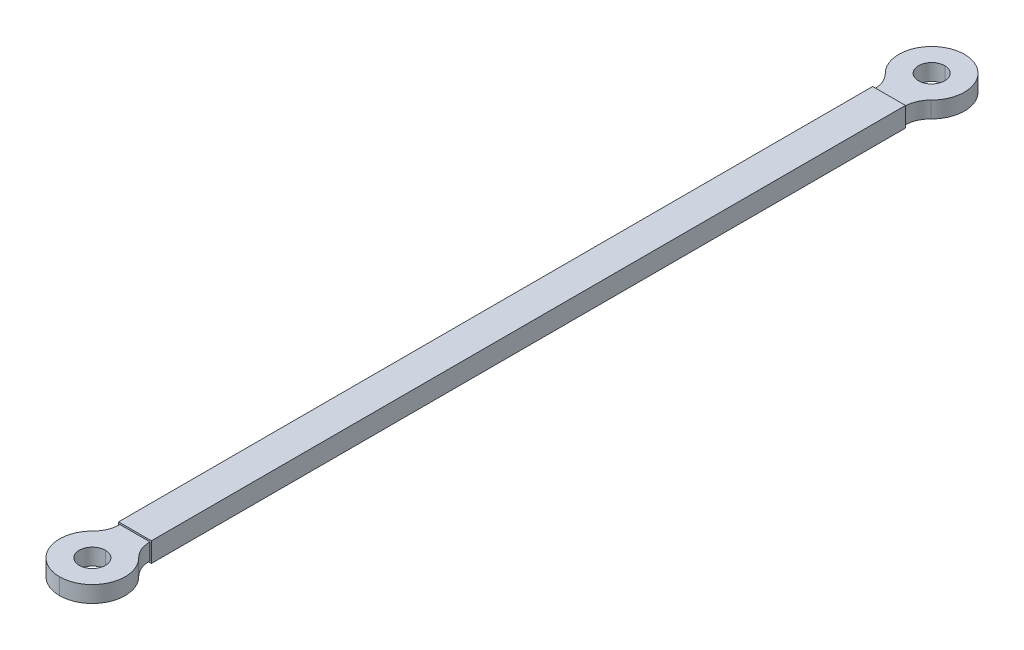
ISO-10303-21;
HEADER;
FILE_DESCRIPTION(('STEP AP214'),'2;1');
FILE_NAME('part.step','',(''),(''),'','','');
FILE_SCHEMA(('AUTOMOTIVE_DESIGN { 1 0 10303 214 1 1 1 1 }'));
ENDSEC;
DATA;
#1=APPLICATION_CONTEXT('core data for automotive mechanical design processes');
#2=APPLICATION_PROTOCOL_DEFINITION('international standard','automotive_design',2000,#1);
#3=PRODUCT_CONTEXT('',#1,'mechanical');
#4=PRODUCT('Part','Part','',(#3));
#5=PRODUCT_RELATED_PRODUCT_CATEGORY('part','',(#4));
#6=PRODUCT_DEFINITION_FORMATION('','',#4);
#7=PRODUCT_DEFINITION_CONTEXT('part definition',#1,'design');
#8=PRODUCT_DEFINITION('design','',#6,#7);
#9=PRODUCT_DEFINITION_SHAPE('','',#8);
#10=(LENGTH_UNIT() NAMED_UNIT(*) SI_UNIT(.MILLI.,.METRE.));
#11=(NAMED_UNIT(*) PLANE_ANGLE_UNIT() SI_UNIT($,.RADIAN.));
#12=(NAMED_UNIT(*) SI_UNIT($,.STERADIAN.) SOLID_ANGLE_UNIT());
#13=UNCERTAINTY_MEASURE_WITH_UNIT(LENGTH_MEASURE(1.E-05),#10,'distance_accuracy_value','');
#14=(GEOMETRIC_REPRESENTATION_CONTEXT(3) GLOBAL_UNCERTAINTY_ASSIGNED_CONTEXT((#13)) GLOBAL_UNIT_ASSIGNED_CONTEXT((#10,
#11,#12)) REPRESENTATION_CONTEXT('',''));
#15=CARTESIAN_POINT('',(0.,0.,0.));
#16=DIRECTION('',(0.,0.,1.));
#17=DIRECTION('',(1.,0.,0.));
#18=AXIS2_PLACEMENT_3D('',#15,#16,#17);
#19=CARTESIAN_POINT('',(-117.23273455505,-360.000000000027,968.57296703716));
#20=DIRECTION('',(0.,-1.,0.));
#21=DIRECTION('',(0.,0.,-1.));
#22=AXIS2_PLACEMENT_3D('',#19,#20,#21);
#23=CYLINDRICAL_SURFACE('',#22,20.);
#24=DIRECTION('',(0.,-1.,0.));
#25=VECTOR('',#24,1.);
#26=CARTESIAN_POINT('',(-117.23273455505,-360.000000000027,988.57296703716));
#27=LINE('',#26,#25);
#28=CARTESIAN_POINT('',(-117.23273455505,-362.500000000031,988.57296703716));
#29=VERTEX_POINT('',#28);
#30=CARTESIAN_POINT('',(-117.23273455505,-387.500000000031,988.57296703716));
#31=VERTEX_POINT('',#30);
#32=EDGE_CURVE('E630',#29,#31,#27,.T.);
#33=ORIENTED_EDGE('',*,*,#32,.F.);
#34=CARTESIAN_POINT('',(-117.23273455505,-362.500000000031,968.57296703716));
#35=DIRECTION('',(0.,-1.,0.));
#36=DIRECTION('',(0.,0.,-1.));
#37=AXIS2_PLACEMENT_3D('',#34,#35,#36);
#38=CIRCLE('',#37,20.);
#39=CARTESIAN_POINT('',(-117.23273455505,-362.500000000031,948.57296703716));
#40=VERTEX_POINT('',#39);
#41=EDGE_CURVE('E376',#40,#29,#38,.T.);
#42=ORIENTED_EDGE('',*,*,#41,.F.);
#43=DIRECTION('',(0.,-1.,0.));
#44=VECTOR('',#43,1.);
#45=CARTESIAN_POINT('',(-117.23273455505,-360.000000000027,948.57296703716));
#46=LINE('',#45,#44);
#47=CARTESIAN_POINT('',(-117.23273455505,-387.500000000031,948.572967037159));
#48=VERTEX_POINT('',#47);
#49=EDGE_CURVE('E612',#40,#48,#46,.T.);
#50=ORIENTED_EDGE('',*,*,#49,.T.);
#51=CARTESIAN_POINT('',(-117.23273455505,-387.500000000031,968.572967037159));
#52=DIRECTION('',(0.,-1.,0.));
#53=DIRECTION('',(0.,0.,-1.));
#54=AXIS2_PLACEMENT_3D('',#51,#52,#53);
#55=CIRCLE('',#54,20.);
#56=EDGE_CURVE('E353',#48,#31,#55,.T.);
#57=ORIENTED_EDGE('',*,*,#56,.T.);
#58=EDGE_LOOP('',(#33,#42,#50,#57));
#59=FACE_BOUND('',#58,.T.);
#60=ADVANCED_FACE('F17',(#59),#23,.F.);
#61=CARTESIAN_POINT('',(-117.23273455505,-387.500000000031,968.572967037159));
#62=DIRECTION('',(0.,1.,0.));
#63=DIRECTION('',(0.,0.,1.));
#64=AXIS2_PLACEMENT_3D('',#61,#62,#63);
#65=CYLINDRICAL_SURFACE('',#64,50.);
#66=CARTESIAN_POINT('',(-117.23273455505,-387.500000000031,968.572967037159));
#67=DIRECTION('',(0.,1.,0.));
#68=DIRECTION('',(0.,0.,1.));
#69=AXIS2_PLACEMENT_3D('',#66,#67,#68);
#70=CIRCLE('',#69,50.);
#71=CARTESIAN_POINT('',(-82.2332550633311,-387.500000000031,1004.2806193726));
#72=VERTEX_POINT('',#71);
#73=CARTESIAN_POINT('',(-152.232214046769,-387.500000000031,1004.2806193726));
#74=VERTEX_POINT('',#73);
#75=EDGE_CURVE('E283',#72,#74,#70,.T.);
#76=ORIENTED_EDGE('',*,*,#75,.T.);
#77=DIRECTION('',(0.,1.,0.));
#78=VECTOR('',#77,1.);
#79=CARTESIAN_POINT('',(-152.232214046769,-387.500000000031,1004.2806193726));
#80=LINE('',#79,#78);
#81=CARTESIAN_POINT('',(-152.232214046769,-362.500000000031,1004.2806193726));
#82=VERTEX_POINT('',#81);
#83=EDGE_CURVE('E11',#74,#82,#80,.T.);
#84=ORIENTED_EDGE('',*,*,#83,.T.);
#85=CARTESIAN_POINT('',(-117.23273455505,-362.500000000031,968.57296703716));
#86=DIRECTION('',(0.,1.,0.));
#87=DIRECTION('',(0.,0.,1.));
#88=AXIS2_PLACEMENT_3D('',#85,#86,#87);
#89=CIRCLE('',#88,50.);
#90=CARTESIAN_POINT('',(-82.2332550633312,-362.500000000031,1004.2806193726));
#91=VERTEX_POINT('',#90);
#92=EDGE_CURVE('E369',#91,#82,#89,.T.);
#93=ORIENTED_EDGE('',*,*,#92,.F.);
#94=DIRECTION('',(0.,-1.,0.));
#95=VECTOR('',#94,1.);
#96=CARTESIAN_POINT('',(-82.2332550633311,-387.500000000031,1004.2806193726));
#97=LINE('',#96,#95);
#98=EDGE_CURVE('E26',#91,#72,#97,.T.);
#99=ORIENTED_EDGE('',*,*,#98,.T.);
#100=EDGE_LOOP('',(#76,#84,#93,#99));
#101=FACE_BOUND('',#100,.T.);
#102=ADVANCED_FACE('F772',(#101),#65,.T.);
#103=CARTESIAN_POINT('',(-180.231797640144,-387.500000000032,1032.84674124095));
#104=DIRECTION('',(0.,1.,0.));
#105=DIRECTION('',(0.,0.,1.));
#106=AXIS2_PLACEMENT_3D('',#103,#104,#105);
#107=CYLINDRICAL_SURFACE('',#106,40.);
#108=CARTESIAN_POINT('',(-180.231797640144,-387.500000000032,1032.84674124095));
#109=DIRECTION('',(0.,-1.,0.));
#110=DIRECTION('',(0.,0.,1.));
#111=AXIS2_PLACEMENT_3D('',#108,#109,#110);
#112=CIRCLE('',#111,40.);
#113=CARTESIAN_POINT('',(-140.23273455505,-387.500000000032,1032.57296703716));
#114=VERTEX_POINT('',#113);
#115=EDGE_CURVE('E287',#74,#114,#112,.T.);
#116=ORIENTED_EDGE('',*,*,#115,.T.);
#117=DIRECTION('',(0.,1.,0.));
#118=VECTOR('',#117,1.);
#119=CARTESIAN_POINT('',(-140.23273455505,-387.500000000032,1032.57296703716));
#120=LINE('',#119,#118);
#121=CARTESIAN_POINT('',(-140.23273455505,-362.500000000032,1032.57296703716));
#122=VERTEX_POINT('',#121);
#123=EDGE_CURVE('E67',#114,#122,#120,.T.);
#124=ORIENTED_EDGE('',*,*,#123,.T.);
#125=CARTESIAN_POINT('',(-180.231797640144,-362.500000000032,1032.84674124095));
#126=DIRECTION('',(0.,-1.,0.));
#127=DIRECTION('',(0.,0.,1.));
#128=AXIS2_PLACEMENT_3D('',#125,#126,#127);
#129=CIRCLE('',#128,40.);
#130=EDGE_CURVE('E373',#82,#122,#129,.T.);
#131=ORIENTED_EDGE('',*,*,#130,.F.);
#132=ORIENTED_EDGE('',*,*,#83,.F.);
#133=EDGE_LOOP('',(#116,#124,#131,#132));
#134=FACE_BOUND('',#133,.T.);
#135=ADVANCED_FACE('F779',(#134),#107,.F.);
#136=CARTESIAN_POINT('',(-54.2336714699559,-387.500000000032,1032.84674124095));
#137=DIRECTION('',(0.,1.,0.));
#138=DIRECTION('',(0.,0.,1.));
#139=AXIS2_PLACEMENT_3D('',#136,#137,#138);
#140=CYLINDRICAL_SURFACE('',#139,40.);
#141=CARTESIAN_POINT('',(-54.2336714699559,-387.500000000032,1032.84674124095));
#142=DIRECTION('',(0.,-1.,0.));
#143=DIRECTION('',(0.,0.,1.));
#144=AXIS2_PLACEMENT_3D('',#141,#142,#143);
#145=CIRCLE('',#144,40.);
#146=CARTESIAN_POINT('',(-94.23273455505,-387.500000000032,1032.57296703716));
#147=VERTEX_POINT('',#146);
#148=EDGE_CURVE('E286',#147,#72,#145,.T.);
#149=ORIENTED_EDGE('',*,*,#148,.T.);
#150=ORIENTED_EDGE('',*,*,#98,.F.);
#151=CARTESIAN_POINT('',(-54.2336714699559,-362.500000000032,1032.84674124095));
#152=DIRECTION('',(0.,-1.,0.));
#153=DIRECTION('',(0.,0.,1.));
#154=AXIS2_PLACEMENT_3D('',#151,#152,#153);
#155=CIRCLE('',#154,40.);
#156=CARTESIAN_POINT('',(-94.23273455505,-362.500000000032,1032.57296703716));
#157=VERTEX_POINT('',#156);
#158=EDGE_CURVE('E346',#157,#91,#155,.T.);
#159=ORIENTED_EDGE('',*,*,#158,.F.);
#160=DIRECTION('',(0.,-1.,0.));
#161=VECTOR('',#160,1.);
#162=CARTESIAN_POINT('',(-94.23273455505,-387.500000000032,1032.57296703716));
#163=LINE('',#162,#161);
#164=EDGE_CURVE('E350',#157,#147,#163,.T.);
#165=ORIENTED_EDGE('',*,*,#164,.T.);
#166=EDGE_LOOP('',(#149,#150,#159,#165));
#167=FACE_BOUND('',#166,.T.);
#168=ADVANCED_FACE('F790',(#167),#140,.F.);
#169=CARTESIAN_POINT('',(-117.23273455505,-360.000000000031,2248.57296703716));
#170=DIRECTION('',(0.,-1.,0.));
#171=DIRECTION('',(0.,0.,-1.));
#172=AXIS2_PLACEMENT_3D('',#169,#170,#171);
#173=CYLINDRICAL_SURFACE('',#172,20.);
#174=DIRECTION('',(0.,-1.,0.));
#175=VECTOR('',#174,1.);
#176=CARTESIAN_POINT('',(-117.23273455505,-360.000000000031,2268.57296703716));
#177=LINE('',#176,#175);
#178=CARTESIAN_POINT('',(-117.23273455505,-362.500000000036,2268.57296703716));
#179=VERTEX_POINT('',#178);
#180=CARTESIAN_POINT('',(-117.23273455505,-387.500000000036,2268.57296703716));
#181=VERTEX_POINT('',#180);
#182=EDGE_CURVE('E660',#179,#181,#177,.T.);
#183=ORIENTED_EDGE('',*,*,#182,.F.);
#184=CARTESIAN_POINT('',(-117.23273455505,-362.500000000036,2248.57296703716));
#185=DIRECTION('',(0.,-1.,0.));
#186=DIRECTION('',(0.,0.,-1.));
#187=AXIS2_PLACEMENT_3D('',#184,#185,#186);
#188=CIRCLE('',#187,20.);
#189=CARTESIAN_POINT('',(-117.23273455505,-362.500000000036,2228.57296703716));
#190=VERTEX_POINT('',#189);
#191=EDGE_CURVE('E280',#190,#179,#188,.T.);
#192=ORIENTED_EDGE('',*,*,#191,.F.);
#193=DIRECTION('',(0.,-1.,0.));
#194=VECTOR('',#193,1.);
#195=CARTESIAN_POINT('',(-117.23273455505,-360.000000000031,2228.57296703716));
#196=LINE('',#195,#194);
#197=CARTESIAN_POINT('',(-117.23273455505,-387.500000000036,2228.57296703716));
#198=VERTEX_POINT('',#197);
#199=EDGE_CURVE('E646',#190,#198,#196,.T.);
#200=ORIENTED_EDGE('',*,*,#199,.T.);
#201=CARTESIAN_POINT('',(-117.23273455505,-387.500000000036,2248.57296703716));
#202=DIRECTION('',(0.,-1.,0.));
#203=DIRECTION('',(0.,0.,-1.));
#204=AXIS2_PLACEMENT_3D('',#201,#202,#203);
#205=CIRCLE('',#204,20.);
#206=EDGE_CURVE('E323',#198,#181,#205,.T.);
#207=ORIENTED_EDGE('',*,*,#206,.T.);
#208=EDGE_LOOP('',(#183,#192,#200,#207));
#209=FACE_BOUND('',#208,.T.);
#210=ADVANCED_FACE('F973',(#209),#173,.F.);
#211=CARTESIAN_POINT('',(-180.231797640144,-387.500000000036,2184.29919283336));
#212=DIRECTION('',(0.,1.,0.));
#213=DIRECTION('',(0.,0.,1.));
#214=AXIS2_PLACEMENT_3D('',#211,#212,#213);
#215=CYLINDRICAL_SURFACE('',#214,40.);
#216=CARTESIAN_POINT('',(-180.231797640144,-387.500000000036,2184.29919283336));
#217=DIRECTION('',(0.,-1.,0.));
#218=DIRECTION('',(0.,0.,1.));
#219=AXIS2_PLACEMENT_3D('',#216,#217,#218);
#220=CIRCLE('',#219,40.);
#221=CARTESIAN_POINT('',(-140.23273455505,-387.500000000036,2184.57296703716));
#222=VERTEX_POINT('',#221);
#223=CARTESIAN_POINT('',(-152.232214046769,-387.500000000036,2212.86531470172));
#224=VERTEX_POINT('',#223);
#225=EDGE_CURVE('E313',#222,#224,#220,.T.);
#226=ORIENTED_EDGE('',*,*,#225,.T.);
#227=DIRECTION('',(0.,-1.,0.));
#228=VECTOR('',#227,1.);
#229=CARTESIAN_POINT('',(-152.232214046769,-387.500000000036,2212.86531470172));
#230=LINE('',#229,#228);
#231=CARTESIAN_POINT('',(-152.232214046769,-362.500000000036,2212.86531470172));
#232=VERTEX_POINT('',#231);
#233=EDGE_CURVE('E675',#232,#224,#230,.T.);
#234=ORIENTED_EDGE('',*,*,#233,.F.);
#235=CARTESIAN_POINT('',(-180.231797640144,-362.500000000036,2184.29919283336));
#236=DIRECTION('',(0.,-1.,0.));
#237=DIRECTION('',(0.,0.,1.));
#238=AXIS2_PLACEMENT_3D('',#235,#236,#237);
#239=CIRCLE('',#238,40.);
#240=CARTESIAN_POINT('',(-140.23273455505,-362.500000000036,2184.57296703716));
#241=VERTEX_POINT('',#240);
#242=EDGE_CURVE('E304',#241,#232,#239,.T.);
#243=ORIENTED_EDGE('',*,*,#242,.F.);
#244=DIRECTION('',(0.,-1.,0.));
#245=VECTOR('',#244,1.);
#246=CARTESIAN_POINT('',(-140.23273455505,-387.500000000036,2184.57296703716));
#247=LINE('',#246,#245);
#248=EDGE_CURVE('E326',#241,#222,#247,.T.);
#249=ORIENTED_EDGE('',*,*,#248,.T.);
#250=EDGE_LOOP('',(#226,#234,#243,#249));
#251=FACE_BOUND('',#250,.T.);
#252=ADVANCED_FACE('F744',(#251),#215,.F.);
#253=CARTESIAN_POINT('',(-117.23273455505,-387.500000000036,2248.57296703716));
#254=DIRECTION('',(0.,1.,0.));
#255=DIRECTION('',(0.,0.,1.));
#256=AXIS2_PLACEMENT_3D('',#253,#254,#255);
#257=CYLINDRICAL_SURFACE('',#256,50.);
#258=DIRECTION('',(0.,1.,0.));
#259=VECTOR('',#258,1.);
#260=CARTESIAN_POINT('',(-117.23273455505,-387.500000000037,2298.57296703716));
#261=LINE('',#260,#259);
#262=CARTESIAN_POINT('',(-117.23273455505,-387.500000000037,2298.57296703716));
#263=VERTEX_POINT('',#262);
#264=CARTESIAN_POINT('',(-117.23273455505,-362.500000000036,2298.57296703716));
#265=VERTEX_POINT('',#264);
#266=EDGE_CURVE('E689',#263,#265,#261,.T.);
#267=ORIENTED_EDGE('',*,*,#266,.F.);
#268=CARTESIAN_POINT('',(-117.23273455505,-387.500000000036,2248.57296703716));
#269=DIRECTION('',(0.,1.,0.));
#270=DIRECTION('',(0.,0.,1.));
#271=AXIS2_PLACEMENT_3D('',#268,#269,#270);
#272=CIRCLE('',#271,50.);
#273=CARTESIAN_POINT('',(-82.2332550633314,-387.500000000036,2212.86531470172));
#274=VERTEX_POINT('',#273);
#275=EDGE_CURVE('E309',#263,#274,#272,.T.);
#276=ORIENTED_EDGE('',*,*,#275,.T.);
#277=DIRECTION('',(0.,1.,0.));
#278=VECTOR('',#277,1.);
#279=CARTESIAN_POINT('',(-82.2332550633315,-387.500000000036,2212.86531470172));
#280=LINE('',#279,#278);
#281=CARTESIAN_POINT('',(-82.2332550633314,-362.500000000036,2212.86531470172));
#282=VERTEX_POINT('',#281);
#283=EDGE_CURVE('E379',#274,#282,#280,.T.);
#284=ORIENTED_EDGE('',*,*,#283,.T.);
#285=CARTESIAN_POINT('',(-117.23273455505,-362.500000000036,2248.57296703716));
#286=DIRECTION('',(0.,1.,0.));
#287=DIRECTION('',(0.,0.,1.));
#288=AXIS2_PLACEMENT_3D('',#285,#286,#287);
#289=CIRCLE('',#288,50.);
#290=EDGE_CURVE('E307',#265,#282,#289,.T.);
#291=ORIENTED_EDGE('',*,*,#290,.F.);
#292=EDGE_LOOP('',(#267,#276,#284,#291));
#293=FACE_BOUND('',#292,.T.);
#294=ADVANCED_FACE('F738',(#293),#257,.T.);
#295=CARTESIAN_POINT('',(-54.2336714699561,-387.500000000036,2184.29919283336));
#296=DIRECTION('',(0.,1.,0.));
#297=DIRECTION('',(0.,0.,1.));
#298=AXIS2_PLACEMENT_3D('',#295,#296,#297);
#299=CYLINDRICAL_SURFACE('',#298,40.);
#300=CARTESIAN_POINT('',(-54.2336714699561,-387.500000000036,2184.29919283336));
#301=DIRECTION('',(0.,-1.,0.));
#302=DIRECTION('',(0.,0.,1.));
#303=AXIS2_PLACEMENT_3D('',#300,#301,#302);
#304=CIRCLE('',#303,40.);
#305=CARTESIAN_POINT('',(-94.2327345550502,-387.500000000036,2184.57296703716));
#306=VERTEX_POINT('',#305);
#307=EDGE_CURVE('E300',#274,#306,#304,.T.);
#308=ORIENTED_EDGE('',*,*,#307,.T.);
#309=DIRECTION('',(0.,1.,0.));
#310=VECTOR('',#309,1.);
#311=CARTESIAN_POINT('',(-94.2327345550502,-387.500000000036,2184.57296703716));
#312=LINE('',#311,#310);
#313=CARTESIAN_POINT('',(-94.2327345550502,-362.500000000036,2184.57296703716));
#314=VERTEX_POINT('',#313);
#315=EDGE_CURVE('E340',#306,#314,#312,.T.);
#316=ORIENTED_EDGE('',*,*,#315,.T.);
#317=CARTESIAN_POINT('',(-54.2336714699561,-362.500000000036,2184.29919283336));
#318=DIRECTION('',(0.,-1.,0.));
#319=DIRECTION('',(0.,0.,1.));
#320=AXIS2_PLACEMENT_3D('',#317,#318,#319);
#321=CIRCLE('',#320,40.);
#322=EDGE_CURVE('E281',#282,#314,#321,.T.);
#323=ORIENTED_EDGE('',*,*,#322,.F.);
#324=ORIENTED_EDGE('',*,*,#283,.F.);
#325=EDGE_LOOP('',(#308,#316,#323,#324));
#326=FACE_BOUND('',#325,.T.);
#327=ADVANCED_FACE('F758',(#326),#299,.F.);
#328=CARTESIAN_POINT('',(-180.231797640144,-362.500000000032,1032.84674124095));
#329=DIRECTION('',(0.,1.,0.));
#330=DIRECTION('',(0.,0.,-1.));
#331=AXIS2_PLACEMENT_3D('',#328,#329,#330);
#332=PLANE('',#331);
#333=ORIENTED_EDGE('',*,*,#41,.T.);
#334=CARTESIAN_POINT('',(-117.23273455505,-362.500000000031,968.57296703716));
#335=DIRECTION('',(0.,-1.,0.));
#336=DIRECTION('',(0.,0.,-1.));
#337=AXIS2_PLACEMENT_3D('',#334,#335,#336);
#338=CIRCLE('',#337,20.);
#339=EDGE_CURVE('E639',#29,#40,#338,.T.);
#340=ORIENTED_EDGE('',*,*,#339,.T.);
#341=EDGE_LOOP('',(#333,#340));
#342=FACE_BOUND('',#341,.T.);
#343=ORIENTED_EDGE('',*,*,#158,.T.);
#344=ORIENTED_EDGE('',*,*,#92,.T.);
#345=ORIENTED_EDGE('',*,*,#130,.T.);
#346=DIRECTION('',(0.,0.,1.));
#347=VECTOR('',#346,1.);
#348=CARTESIAN_POINT('',(-140.23273455505,-362.500000000032,1032.57296703716));
#349=LINE('',#348,#347);
#350=CARTESIAN_POINT('',(-140.23273455505,-362.500000000032,1033.57296703716));
#351=VERTEX_POINT('',#350);
#352=EDGE_CURVE('E347',#122,#351,#349,.T.);
#353=ORIENTED_EDGE('',*,*,#352,.T.);
#354=DIRECTION('',(-1.,0.,0.));
#355=VECTOR('',#354,1.);
#356=CARTESIAN_POINT('',(-142.23273455505,-362.500000000032,1033.57296703716));
#357=LINE('',#356,#355);
#358=CARTESIAN_POINT('',(-94.23273455505,-362.500000000032,1033.57296703716));
#359=VERTEX_POINT('',#358);
#360=EDGE_CURVE('E295',#359,#351,#357,.T.);
#361=ORIENTED_EDGE('',*,*,#360,.F.);
#362=DIRECTION('',(0.,0.,-1.));
#363=VECTOR('',#362,1.);
#364=CARTESIAN_POINT('',(-94.23273455505,-362.500000000032,1032.57296703716));
#365=LINE('',#364,#363);
#366=EDGE_CURVE('E357',#359,#157,#365,.T.);
#367=ORIENTED_EDGE('',*,*,#366,.T.);
#368=EDGE_LOOP('',(#343,#344,#345,#353,#361,#367));
#369=FACE_BOUND('',#368,.T.);
#370=ADVANCED_FACE('F760',(#342,#369),#332,.T.);
#371=CARTESIAN_POINT('',(-140.23273455505,-387.500000000032,1032.57296703716));
#372=DIRECTION('',(1.,0.,0.));
#373=DIRECTION('',(0.,1.,0.));
#374=AXIS2_PLACEMENT_3D('',#371,#372,#373);
#375=PLANE('',#374);
#376=ORIENTED_EDGE('',*,*,#352,.F.);
#377=ORIENTED_EDGE('',*,*,#123,.F.);
#378=DIRECTION('',(0.,0.,1.));
#379=VECTOR('',#378,1.);
#380=CARTESIAN_POINT('',(-140.23273455505,-387.500000000032,1032.84674124095));
#381=LINE('',#380,#379);
#382=CARTESIAN_POINT('',(-140.23273455505,-387.500000000032,1033.57296703716));
#383=VERTEX_POINT('',#382);
#384=EDGE_CURVE('E361',#114,#383,#381,.T.);
#385=ORIENTED_EDGE('',*,*,#384,.T.);
#386=DIRECTION('',(0.,-1.,0.));
#387=VECTOR('',#386,1.);
#388=CARTESIAN_POINT('',(-140.23273455505,-360.000000000032,1033.57296703716));
#389=LINE('',#388,#387);
#390=EDGE_CURVE('E296',#351,#383,#389,.T.);
#391=ORIENTED_EDGE('',*,*,#390,.F.);
#392=EDGE_LOOP('',(#376,#377,#385,#391));
#393=FACE_BOUND('',#392,.T.);
#394=ADVANCED_FACE('F767',(#393),#375,.F.);
#395=CARTESIAN_POINT('',(-180.231797640144,-387.500000000032,1032.84674124095));
#396=DIRECTION('',(0.,1.,0.));
#397=DIRECTION('',(0.,0.,-1.));
#398=AXIS2_PLACEMENT_3D('',#395,#396,#397);
#399=PLANE('',#398);
#400=ORIENTED_EDGE('',*,*,#56,.F.);
#401=CARTESIAN_POINT('',(-117.23273455505,-387.500000000031,968.572967037159));
#402=DIRECTION('',(0.,-1.,0.));
#403=DIRECTION('',(0.,0.,-1.));
#404=AXIS2_PLACEMENT_3D('',#401,#402,#403);
#405=CIRCLE('',#404,20.);
#406=EDGE_CURVE('E621',#31,#48,#405,.T.);
#407=ORIENTED_EDGE('',*,*,#406,.F.);
#408=EDGE_LOOP('',(#400,#407));
#409=FACE_BOUND('',#408,.T.);
#410=ORIENTED_EDGE('',*,*,#384,.F.);
#411=ORIENTED_EDGE('',*,*,#115,.F.);
#412=ORIENTED_EDGE('',*,*,#75,.F.);
#413=ORIENTED_EDGE('',*,*,#148,.F.);
#414=DIRECTION('',(0.,0.,1.));
#415=VECTOR('',#414,1.);
#416=CARTESIAN_POINT('',(-94.23273455505,-387.500000000032,1032.57296703716));
#417=LINE('',#416,#415);
#418=CARTESIAN_POINT('',(-94.23273455505,-387.500000000032,1033.57296703716));
#419=VERTEX_POINT('',#418);
#420=EDGE_CURVE('E343',#147,#419,#417,.T.);
#421=ORIENTED_EDGE('',*,*,#420,.T.);
#422=DIRECTION('',(1.,0.,0.));
#423=VECTOR('',#422,1.);
#424=CARTESIAN_POINT('',(-142.23273455505,-387.500000000032,1033.57296703716));
#425=LINE('',#424,#423);
#426=EDGE_CURVE('E226',#383,#419,#425,.T.);
#427=ORIENTED_EDGE('',*,*,#426,.F.);
#428=EDGE_LOOP('',(#410,#411,#412,#413,#421,#427));
#429=FACE_BOUND('',#428,.T.);
#430=ADVANCED_FACE('F796',(#409,#429),#399,.F.);
#431=CARTESIAN_POINT('',(-94.23273455505,-387.500000000032,1032.57296703716));
#432=DIRECTION('',(-1.,0.,0.));
#433=DIRECTION('',(0.,0.,1.));
#434=AXIS2_PLACEMENT_3D('',#431,#432,#433);
#435=PLANE('',#434);
#436=ORIENTED_EDGE('',*,*,#420,.F.);
#437=ORIENTED_EDGE('',*,*,#164,.F.);
#438=ORIENTED_EDGE('',*,*,#366,.F.);
#439=DIRECTION('',(0.,1.,0.));
#440=VECTOR('',#439,1.);
#441=CARTESIAN_POINT('',(-94.23273455505,-360.000000000032,1033.57296703716));
#442=LINE('',#441,#440);
#443=EDGE_CURVE('E291',#419,#359,#442,.T.);
#444=ORIENTED_EDGE('',*,*,#443,.F.);
#445=EDGE_LOOP('',(#436,#437,#438,#444));
#446=FACE_BOUND('',#445,.T.);
#447=ADVANCED_FACE('F802',(#446),#435,.F.);
#448=CARTESIAN_POINT('',(-94.2327345550502,-387.500000000036,2184.57296703716));
#449=DIRECTION('',(-1.,0.,0.));
#450=DIRECTION('',(0.,0.,1.));
#451=AXIS2_PLACEMENT_3D('',#448,#449,#450);
#452=PLANE('',#451);
#453=ORIENTED_EDGE('',*,*,#315,.F.);
#454=DIRECTION('',(0.,0.,-1.));
#455=VECTOR('',#454,1.);
#456=CARTESIAN_POINT('',(-94.2327345550502,-387.500000000036,2184.29919283336));
#457=LINE('',#456,#455);
#458=CARTESIAN_POINT('',(-94.2327345550502,-387.500000000036,2183.57296703716));
#459=VERTEX_POINT('',#458);
#460=EDGE_CURVE('E320',#306,#459,#457,.T.);
#461=ORIENTED_EDGE('',*,*,#460,.T.);
#462=DIRECTION('',(0.,1.,0.));
#463=VECTOR('',#462,1.);
#464=CARTESIAN_POINT('',(-94.2327345550502,-360.000000000036,2183.57296703716));
#465=LINE('',#464,#463);
#466=CARTESIAN_POINT('',(-94.2327345550502,-362.500000000036,2183.57296703716));
#467=VERTEX_POINT('',#466);
#468=EDGE_CURVE('E265',#459,#467,#465,.T.);
#469=ORIENTED_EDGE('',*,*,#468,.T.);
#470=DIRECTION('',(0.,0.,-1.));
#471=VECTOR('',#470,1.);
#472=CARTESIAN_POINT('',(-94.2327345550502,-362.500000000036,2184.29919283336));
#473=LINE('',#472,#471);
#474=EDGE_CURVE('E278',#314,#467,#473,.T.);
#475=ORIENTED_EDGE('',*,*,#474,.F.);
#476=EDGE_LOOP('',(#453,#461,#469,#475));
#477=FACE_BOUND('',#476,.T.);
#478=ADVANCED_FACE('F756',(#477),#452,.F.);
#479=CARTESIAN_POINT('',(-54.2336714699561,-362.500000000036,2184.29919283336));
#480=DIRECTION('',(0.,1.,0.));
#481=DIRECTION('',(0.,0.,-1.));
#482=AXIS2_PLACEMENT_3D('',#479,#480,#481);
#483=PLANE('',#482);
#484=ORIENTED_EDGE('',*,*,#191,.T.);
#485=CARTESIAN_POINT('',(-117.23273455505,-362.500000000036,2248.57296703716));
#486=DIRECTION('',(0.,-1.,0.));
#487=DIRECTION('',(0.,0.,-1.));
#488=AXIS2_PLACEMENT_3D('',#485,#486,#487);
#489=CIRCLE('',#488,20.);
#490=EDGE_CURVE('E667',#179,#190,#489,.T.);
#491=ORIENTED_EDGE('',*,*,#490,.T.);
#492=EDGE_LOOP('',(#484,#491));
#493=FACE_BOUND('',#492,.T.);
#494=DIRECTION('',(0.,0.,1.));
#495=VECTOR('',#494,1.);
#496=CARTESIAN_POINT('',(-140.23273455505,-362.500000000036,2184.57296703716));
#497=LINE('',#496,#495);
#498=CARTESIAN_POINT('',(-140.23273455505,-362.500000000036,2183.57296703716));
#499=VERTEX_POINT('',#498);
#500=EDGE_CURVE('E308',#499,#241,#497,.T.);
#501=ORIENTED_EDGE('',*,*,#500,.T.);
#502=ORIENTED_EDGE('',*,*,#242,.T.);
#503=CARTESIAN_POINT('',(-117.23273455505,-362.500000000036,2248.57296703716));
#504=DIRECTION('',(0.,1.,0.));
#505=DIRECTION('',(0.,0.,1.));
#506=AXIS2_PLACEMENT_3D('',#503,#504,#505);
#507=CIRCLE('',#506,50.);
#508=EDGE_CURVE('E682',#232,#265,#507,.T.);
#509=ORIENTED_EDGE('',*,*,#508,.T.);
#510=ORIENTED_EDGE('',*,*,#290,.T.);
#511=ORIENTED_EDGE('',*,*,#322,.T.);
#512=ORIENTED_EDGE('',*,*,#474,.T.);
#513=DIRECTION('',(-1.,0.,0.));
#514=VECTOR('',#513,1.);
#515=CARTESIAN_POINT('',(-142.23273455505,-362.500000000036,2183.57296703716));
#516=LINE('',#515,#514);
#517=EDGE_CURVE('E261',#467,#499,#516,.T.);
#518=ORIENTED_EDGE('',*,*,#517,.T.);
#519=EDGE_LOOP('',(#501,#502,#509,#510,#511,#512,#518));
#520=FACE_BOUND('',#519,.T.);
#521=ADVANCED_FACE('F741',(#493,#520),#483,.T.);
#522=CARTESIAN_POINT('',(-140.23273455505,-387.500000000036,2184.57296703716));
#523=DIRECTION('',(1.,0.,0.));
#524=DIRECTION('',(0.,-1.,0.));
#525=AXIS2_PLACEMENT_3D('',#522,#523,#524);
#526=PLANE('',#525);
#527=ORIENTED_EDGE('',*,*,#248,.F.);
#528=ORIENTED_EDGE('',*,*,#500,.F.);
#529=DIRECTION('',(0.,-1.,0.));
#530=VECTOR('',#529,1.);
#531=CARTESIAN_POINT('',(-140.23273455505,-360.000000000036,2183.57296703716));
#532=LINE('',#531,#530);
#533=CARTESIAN_POINT('',(-140.23273455505,-387.500000000036,2183.57296703716));
#534=VERTEX_POINT('',#533);
#535=EDGE_CURVE('E257',#499,#534,#532,.T.);
#536=ORIENTED_EDGE('',*,*,#535,.T.);
#537=DIRECTION('',(0.,0.,1.));
#538=VECTOR('',#537,1.);
#539=CARTESIAN_POINT('',(-140.23273455505,-387.500000000036,2184.29919283336));
#540=LINE('',#539,#538);
#541=EDGE_CURVE('E316',#534,#222,#540,.T.);
#542=ORIENTED_EDGE('',*,*,#541,.T.);
#543=EDGE_LOOP('',(#527,#528,#536,#542));
#544=FACE_BOUND('',#543,.T.);
#545=ADVANCED_FACE('F746',(#544),#526,.F.);
#546=CARTESIAN_POINT('',(-54.2336714699561,-387.500000000036,2184.29919283336));
#547=DIRECTION('',(0.,1.,0.));
#548=DIRECTION('',(0.,0.,-1.));
#549=AXIS2_PLACEMENT_3D('',#546,#547,#548);
#550=PLANE('',#549);
#551=ORIENTED_EDGE('',*,*,#206,.F.);
#552=CARTESIAN_POINT('',(-117.23273455505,-387.500000000036,2248.57296703716));
#553=DIRECTION('',(0.,-1.,0.));
#554=DIRECTION('',(0.,0.,-1.));
#555=AXIS2_PLACEMENT_3D('',#552,#553,#554);
#556=CIRCLE('',#555,20.);
#557=EDGE_CURVE('E653',#181,#198,#556,.T.);
#558=ORIENTED_EDGE('',*,*,#557,.F.);
#559=EDGE_LOOP('',(#551,#558));
#560=FACE_BOUND('',#559,.T.);
#561=ORIENTED_EDGE('',*,*,#307,.F.);
#562=ORIENTED_EDGE('',*,*,#275,.F.);
#563=CARTESIAN_POINT('',(-117.23273455505,-387.500000000036,2248.57296703716));
#564=DIRECTION('',(0.,1.,0.));
#565=DIRECTION('',(0.,0.,1.));
#566=AXIS2_PLACEMENT_3D('',#563,#564,#565);
#567=CIRCLE('',#566,50.);
#568=EDGE_CURVE('E696',#224,#263,#567,.T.);
#569=ORIENTED_EDGE('',*,*,#568,.F.);
#570=ORIENTED_EDGE('',*,*,#225,.F.);
#571=ORIENTED_EDGE('',*,*,#541,.F.);
#572=DIRECTION('',(1.,0.,0.));
#573=VECTOR('',#572,1.);
#574=CARTESIAN_POINT('',(-142.23273455505,-387.500000000036,2183.57296703716));
#575=LINE('',#574,#573);
#576=EDGE_CURVE('E269',#534,#459,#575,.T.);
#577=ORIENTED_EDGE('',*,*,#576,.T.);
#578=ORIENTED_EDGE('',*,*,#460,.F.);
#579=EDGE_LOOP('',(#561,#562,#569,#570,#571,#577,#578));
#580=FACE_BOUND('',#579,.T.);
#581=ADVANCED_FACE('F735',(#560,#580),#550,.F.);
#582=CARTESIAN_POINT('',(-142.23273455505,-360.000000000036,2183.57296703716));
#583=DIRECTION('',(0.,-1.,0.));
#584=DIRECTION('',(0.,0.,-1.));
#585=AXIS2_PLACEMENT_3D('',#582,#583,#584);
#586=PLANE('',#585);
#587=DIRECTION('',(1.,0.,0.));
#588=VECTOR('',#587,1.);
#589=CARTESIAN_POINT('',(-142.23273455505,-360.000000000035,2183.57296703716));
#590=LINE('',#589,#588);
#591=CARTESIAN_POINT('',(-142.23273455505,-360.000000000033,2183.57296703716));
#592=VERTEX_POINT('',#591);
#593=CARTESIAN_POINT('',(-92.23273455505,-360.000000000036,2183.57296703716));
#594=VERTEX_POINT('',#593);
#595=EDGE_CURVE('E232',#592,#594,#590,.T.);
#596=ORIENTED_EDGE('',*,*,#595,.T.);
#597=DIRECTION('',(0.,0.,-1.));
#598=VECTOR('',#597,1.);
#599=CARTESIAN_POINT('',(-92.23273455505,-360.000000000036,2183.57296703716));
#600=LINE('',#599,#598);
#601=CARTESIAN_POINT('',(-92.23273455505,-360.000000000033,1033.57296703716));
#602=VERTEX_POINT('',#601);
#603=EDGE_CURVE('E229',#594,#602,#600,.T.);
#604=ORIENTED_EDGE('',*,*,#603,.T.);
#605=DIRECTION('',(1.,0.,0.));
#606=VECTOR('',#605,1.);
#607=CARTESIAN_POINT('',(-142.23273455505,-360.000000000032,1033.57296703716));
#608=LINE('',#607,#606);
#609=CARTESIAN_POINT('',(-142.23273455505,-360.000000000032,1033.57296703716));
#610=VERTEX_POINT('',#609);
#611=EDGE_CURVE('E215',#610,#602,#608,.T.);
#612=ORIENTED_EDGE('',*,*,#611,.F.);
#613=DIRECTION('',(0.,0.,1.));
#614=VECTOR('',#613,1.);
#615=CARTESIAN_POINT('',(-142.23273455505,-360.000000000032,2183.57296703716));
#616=LINE('',#615,#614);
#617=EDGE_CURVE('E273',#610,#592,#616,.T.);
#618=ORIENTED_EDGE('',*,*,#617,.T.);
#619=EDGE_LOOP('',(#596,#604,#612,#618));
#620=FACE_BOUND('',#619,.T.);
#621=ADVANCED_FACE('F230',(#620),#586,.F.);
#622=CARTESIAN_POINT('',(-142.23273455505,-360.000000000032,1033.57296703716));
#623=DIRECTION('',(0.,0.,-1.));
#624=DIRECTION('',(-1.,0.,0.));
#625=AXIS2_PLACEMENT_3D('',#622,#623,#624);
#626=PLANE('',#625);
#627=ORIENTED_EDGE('',*,*,#426,.T.);
#628=ORIENTED_EDGE('',*,*,#443,.T.);
#629=ORIENTED_EDGE('',*,*,#360,.T.);
#630=ORIENTED_EDGE('',*,*,#390,.T.);
#631=EDGE_LOOP('',(#627,#628,#629,#630));
#632=FACE_BOUND('',#631,.T.);
#633=DIRECTION('',(-1.,0.,0.));
#634=VECTOR('',#633,1.);
#635=CARTESIAN_POINT('',(-92.23273455505,-390.000000000032,1033.57296703716));
#636=LINE('',#635,#634);
#637=CARTESIAN_POINT('',(-92.23273455505,-390.000000000032,1033.57296703716));
#638=VERTEX_POINT('',#637);
#639=CARTESIAN_POINT('',(-142.23273455505,-390.000000000033,1033.57296703716));
#640=VERTEX_POINT('',#639);
#641=EDGE_CURVE('E588',#638,#640,#636,.T.);
#642=ORIENTED_EDGE('',*,*,#641,.T.);
#643=DIRECTION('',(0.,1.,0.));
#644=VECTOR('',#643,1.);
#645=CARTESIAN_POINT('',(-142.23273455505,-366.000000000036,1033.57296703716));
#646=LINE('',#645,#644);
#647=EDGE_CURVE('E222',#640,#610,#646,.T.);
#648=ORIENTED_EDGE('',*,*,#647,.T.);
#649=ORIENTED_EDGE('',*,*,#611,.T.);
#650=DIRECTION('',(0.,-1.,0.));
#651=VECTOR('',#650,1.);
#652=CARTESIAN_POINT('',(-92.23273455505,-360.000000000036,1033.57296703716));
#653=LINE('',#652,#651);
#654=EDGE_CURVE('E220',#602,#638,#653,.T.);
#655=ORIENTED_EDGE('',*,*,#654,.T.);
#656=EDGE_LOOP('',(#642,#648,#649,#655));
#657=FACE_BOUND('',#656,.T.);
#658=ADVANCED_FACE('F218',(#632,#657),#626,.T.);
#659=CARTESIAN_POINT('',(-142.23273455505,-366.000000000036,2183.57296703716));
#660=DIRECTION('',(1.,0.,0.));
#661=DIRECTION('',(0.,1.,0.));
#662=AXIS2_PLACEMENT_3D('',#659,#660,#661);
#663=PLANE('',#662);
#664=DIRECTION('',(0.,1.,0.));
#665=VECTOR('',#664,1.);
#666=CARTESIAN_POINT('',(-142.23273455505,-360.000000000036,2183.57296703716));
#667=LINE('',#666,#665);
#668=CARTESIAN_POINT('',(-142.23273455505,-390.000000000036,2183.57296703716));
#669=VERTEX_POINT('',#668);
#670=EDGE_CURVE('E253',#669,#592,#667,.T.);
#671=ORIENTED_EDGE('',*,*,#670,.T.);
#672=ORIENTED_EDGE('',*,*,#617,.F.);
#673=ORIENTED_EDGE('',*,*,#647,.F.);
#674=DIRECTION('',(0.,0.,1.));
#675=VECTOR('',#674,1.);
#676=CARTESIAN_POINT('',(-142.23273455505,-390.000000000036,2183.57296703716));
#677=LINE('',#676,#675);
#678=EDGE_CURVE('E595',#640,#669,#677,.T.);
#679=ORIENTED_EDGE('',*,*,#678,.T.);
#680=EDGE_LOOP('',(#671,#672,#673,#679));
#681=FACE_BOUND('',#680,.T.);
#682=ADVANCED_FACE('F889',(#681),#663,.F.);
#683=CARTESIAN_POINT('',(-142.23273455505,-360.000000000036,2183.57296703716));
#684=DIRECTION('',(0.,0.,-1.));
#685=DIRECTION('',(-1.,0.,0.));
#686=AXIS2_PLACEMENT_3D('',#683,#684,#685);
#687=PLANE('',#686);
#688=ORIENTED_EDGE('',*,*,#535,.F.);
#689=ORIENTED_EDGE('',*,*,#517,.F.);
#690=ORIENTED_EDGE('',*,*,#468,.F.);
#691=ORIENTED_EDGE('',*,*,#576,.F.);
#692=EDGE_LOOP('',(#688,#689,#690,#691));
#693=FACE_BOUND('',#692,.T.);
#694=DIRECTION('',(0.,1.,0.));
#695=VECTOR('',#694,1.);
#696=CARTESIAN_POINT('',(-92.23273455505,-360.000000000036,2183.57296703716));
#697=LINE('',#696,#695);
#698=CARTESIAN_POINT('',(-92.23273455505,-390.000000000035,2183.57296703716));
#699=VERTEX_POINT('',#698);
#700=EDGE_CURVE('E242',#699,#594,#697,.T.);
#701=ORIENTED_EDGE('',*,*,#700,.T.);
#702=ORIENTED_EDGE('',*,*,#595,.F.);
#703=ORIENTED_EDGE('',*,*,#670,.F.);
#704=DIRECTION('',(1.,0.,0.));
#705=VECTOR('',#704,1.);
#706=CARTESIAN_POINT('',(-92.23273455505,-390.000000000036,2183.57296703716));
#707=LINE('',#706,#705);
#708=EDGE_CURVE('E603',#669,#699,#707,.T.);
#709=ORIENTED_EDGE('',*,*,#708,.T.);
#710=EDGE_LOOP('',(#701,#702,#703,#709));
#711=FACE_BOUND('',#710,.T.);
#712=ADVANCED_FACE('F751',(#693,#711),#687,.F.);
#713=CARTESIAN_POINT('',(-92.23273455505,-360.000000000036,2183.57296703716));
#714=DIRECTION('',(-1.,0.,0.));
#715=DIRECTION('',(0.,1.,0.));
#716=AXIS2_PLACEMENT_3D('',#713,#714,#715);
#717=PLANE('',#716);
#718=ORIENTED_EDGE('',*,*,#700,.F.);
#719=DIRECTION('',(0.,0.,-1.));
#720=VECTOR('',#719,1.);
#721=CARTESIAN_POINT('',(-92.23273455505,-390.000000000036,2183.57296703716));
#722=LINE('',#721,#720);
#723=EDGE_CURVE('E239',#699,#638,#722,.T.);
#724=ORIENTED_EDGE('',*,*,#723,.T.);
#725=ORIENTED_EDGE('',*,*,#654,.F.);
#726=ORIENTED_EDGE('',*,*,#603,.F.);
#727=EDGE_LOOP('',(#718,#724,#725,#726));
#728=FACE_BOUND('',#727,.T.);
#729=ADVANCED_FACE('F237',(#728),#717,.F.);
#730=CARTESIAN_POINT('',(-92.23273455505,-390.000000000036,2183.57296703716));
#731=DIRECTION('',(0.,1.,0.));
#732=DIRECTION('',(0.,0.,-1.));
#733=AXIS2_PLACEMENT_3D('',#730,#731,#732);
#734=PLANE('',#733);
#735=ORIENTED_EDGE('',*,*,#708,.F.);
#736=ORIENTED_EDGE('',*,*,#678,.F.);
#737=ORIENTED_EDGE('',*,*,#641,.F.);
#738=ORIENTED_EDGE('',*,*,#723,.F.);
#739=EDGE_LOOP('',(#735,#736,#737,#738));
#740=FACE_BOUND('',#739,.T.);
#741=ADVANCED_FACE('F919',(#740),#734,.F.);
#742=CARTESIAN_POINT('',(-117.23273455505,-360.000000000027,968.57296703716));
#743=DIRECTION('',(0.,-1.,0.));
#744=DIRECTION('',(0.,0.,-1.));
#745=AXIS2_PLACEMENT_3D('',#742,#743,#744);
#746=CYLINDRICAL_SURFACE('',#745,20.);
#747=ORIENTED_EDGE('',*,*,#339,.F.);
#748=ORIENTED_EDGE('',*,*,#32,.T.);
#749=ORIENTED_EDGE('',*,*,#406,.T.);
#750=ORIENTED_EDGE('',*,*,#49,.F.);
#751=EDGE_LOOP('',(#747,#748,#749,#750));
#752=FACE_BOUND('',#751,.T.);
#753=ADVANCED_FACE('F785',(#752),#746,.F.);
#754=CARTESIAN_POINT('',(-117.23273455505,-360.000000000031,2248.57296703716));
#755=DIRECTION('',(0.,-1.,0.));
#756=DIRECTION('',(0.,0.,-1.));
#757=AXIS2_PLACEMENT_3D('',#754,#755,#756);
#758=CYLINDRICAL_SURFACE('',#757,20.);
#759=ORIENTED_EDGE('',*,*,#490,.F.);
#760=ORIENTED_EDGE('',*,*,#182,.T.);
#761=ORIENTED_EDGE('',*,*,#557,.T.);
#762=ORIENTED_EDGE('',*,*,#199,.F.);
#763=EDGE_LOOP('',(#759,#760,#761,#762));
#764=FACE_BOUND('',#763,.T.);
#765=ADVANCED_FACE('F941',(#764),#758,.F.);
#766=CARTESIAN_POINT('',(-117.23273455505,-387.500000000036,2248.57296703716));
#767=DIRECTION('',(0.,1.,0.));
#768=DIRECTION('',(0.,0.,1.));
#769=AXIS2_PLACEMENT_3D('',#766,#767,#768);
#770=CYLINDRICAL_SURFACE('',#769,50.);
#771=ORIENTED_EDGE('',*,*,#568,.T.);
#772=ORIENTED_EDGE('',*,*,#266,.T.);
#773=ORIENTED_EDGE('',*,*,#508,.F.);
#774=ORIENTED_EDGE('',*,*,#233,.T.);
#775=EDGE_LOOP('',(#771,#772,#773,#774));
#776=FACE_BOUND('',#775,.T.);
#777=ADVANCED_FACE('F728',(#776),#770,.T.);
#778=CLOSED_SHELL('',(#60,#102,#135,#168,#210,#252,#294,#327,#370,#394,#430,#447,#478,#521,#545,
#581,#621,#658,#682,#712,#729,#741,#753,#765,#777));
#779=MANIFOLD_SOLID_BREP('B1',#778);
#780=ADVANCED_BREP_SHAPE_REPRESENTATION('',(#18,#779),#14);
#781=SHAPE_DEFINITION_REPRESENTATION(#9,#780);
ENDSEC;
END-ISO-10303-21;
